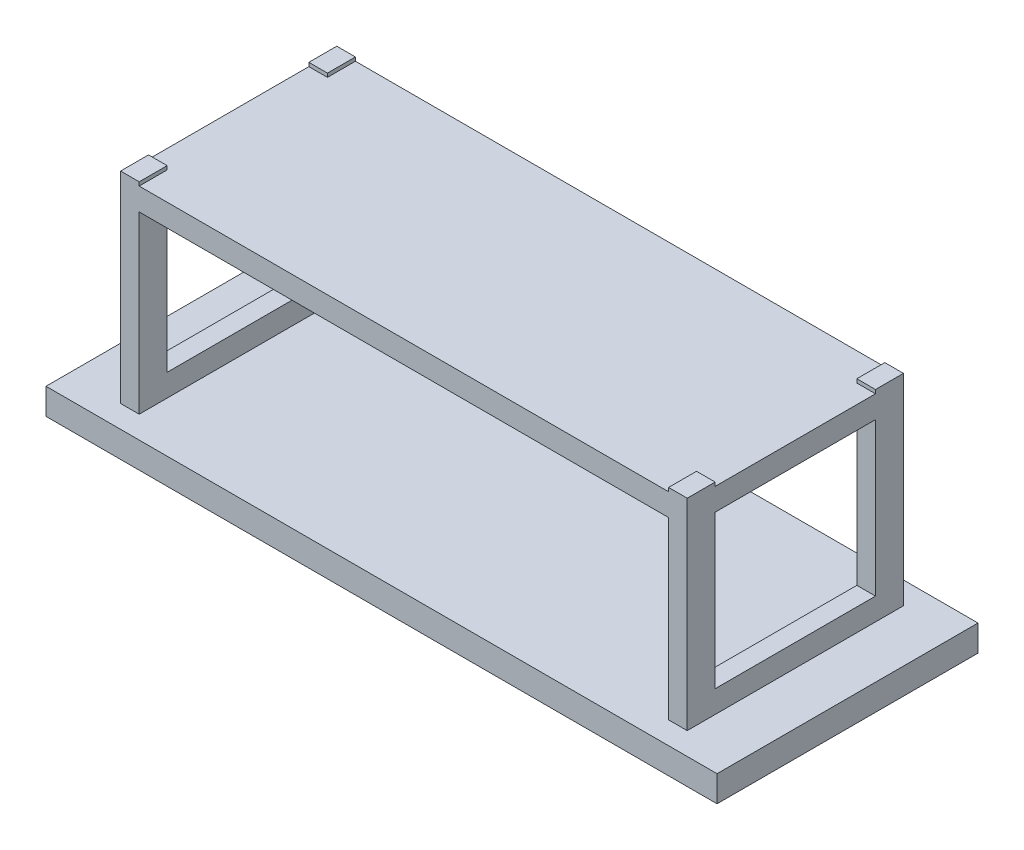
ISO-10303-21;
HEADER;
FILE_DESCRIPTION(('STEP AP214'),'2;1');
FILE_NAME('part.step','',(''),(''),'','','');
FILE_SCHEMA(('AUTOMOTIVE_DESIGN { 1 0 10303 214 1 1 1 1 }'));
ENDSEC;
DATA;
#1=APPLICATION_CONTEXT('core data for automotive mechanical design processes');
#2=APPLICATION_PROTOCOL_DEFINITION('international standard','automotive_design',2000,#1);
#3=PRODUCT_CONTEXT('',#1,'mechanical');
#4=PRODUCT('Part','Part','',(#3));
#5=PRODUCT_RELATED_PRODUCT_CATEGORY('part','',(#4));
#6=PRODUCT_DEFINITION_FORMATION('','',#4);
#7=PRODUCT_DEFINITION_CONTEXT('part definition',#1,'design');
#8=PRODUCT_DEFINITION('design','',#6,#7);
#9=PRODUCT_DEFINITION_SHAPE('','',#8);
#10=(LENGTH_UNIT() NAMED_UNIT(*) SI_UNIT(.MILLI.,.METRE.));
#11=(NAMED_UNIT(*) PLANE_ANGLE_UNIT() SI_UNIT($,.RADIAN.));
#12=(NAMED_UNIT(*) SI_UNIT($,.STERADIAN.) SOLID_ANGLE_UNIT());
#13=UNCERTAINTY_MEASURE_WITH_UNIT(LENGTH_MEASURE(1.E-05),#10,'distance_accuracy_value','');
#14=(GEOMETRIC_REPRESENTATION_CONTEXT(3) GLOBAL_UNCERTAINTY_ASSIGNED_CONTEXT((#13)) GLOBAL_UNIT_ASSIGNED_CONTEXT((#10,
#11,#12)) REPRESENTATION_CONTEXT('',''));
#15=CARTESIAN_POINT('',(0.,0.,0.));
#16=DIRECTION('',(0.,0.,1.));
#17=DIRECTION('',(1.,0.,0.));
#18=AXIS2_PLACEMENT_3D('',#15,#16,#17);
#19=CARTESIAN_POINT('',(190.,130.,-640.));
#20=DIRECTION('',(-1.,0.,0.));
#21=DIRECTION('',(0.,0.,1.));
#22=AXIS2_PLACEMENT_3D('',#19,#20,#21);
#23=PLANE('',#22);
#24=DIRECTION('',(0.,0.,-1.));
#25=VECTOR('',#24,1.);
#26=CARTESIAN_POINT('',(189.999999999998,600.,-59.9999999998558));
#27=LINE('',#26,#25);
#28=CARTESIAN_POINT('',(190.,600.,-565.));
#29=VERTEX_POINT('',#28);
#30=CARTESIAN_POINT('',(189.999999999998,600.,-639.999999999999));
#31=VERTEX_POINT('',#30);
#32=EDGE_CURVE('E249',#29,#31,#27,.T.);
#33=ORIENTED_EDGE('',*,*,#32,.T.);
#34=DIRECTION('',(0.,-1.,0.));
#35=VECTOR('',#34,1.);
#36=CARTESIAN_POINT('',(190.,130.,-640.));
#37=LINE('',#36,#35);
#38=CARTESIAN_POINT('',(190.,610.,-640.));
#39=VERTEX_POINT('',#38);
#40=EDGE_CURVE('E260',#39,#31,#37,.T.);
#41=ORIENTED_EDGE('',*,*,#40,.F.);
#42=DIRECTION('',(0.,0.,-1.));
#43=VECTOR('',#42,1.);
#44=CARTESIAN_POINT('',(190.,610.,-640.));
#45=LINE('',#44,#43);
#46=CARTESIAN_POINT('',(190.,610.,-565.));
#47=VERTEX_POINT('',#46);
#48=EDGE_CURVE('E497',#47,#39,#45,.T.);
#49=ORIENTED_EDGE('',*,*,#48,.F.);
#50=DIRECTION('',(0.,-1.,0.));
#51=VECTOR('',#50,1.);
#52=CARTESIAN_POINT('',(190.,610.,-565.));
#53=LINE('',#52,#51);
#54=EDGE_CURVE('E263',#47,#29,#53,.T.);
#55=ORIENTED_EDGE('',*,*,#54,.T.);
#56=EDGE_LOOP('',(#33,#41,#49,#55));
#57=FACE_BOUND('',#56,.T.);
#58=ADVANCED_FACE('F33',(#57),#23,.F.);
#59=CARTESIAN_POINT('',(189.999999999998,600.,-59.9999999999995));
#60=VERTEX_POINT('',#59);
#61=CARTESIAN_POINT('',(189.999999999998,600.,-134.999999999991));
#62=VERTEX_POINT('',#61);
#63=EDGE_CURVE('E264',#60,#62,#27,.T.);
#64=ORIENTED_EDGE('',*,*,#63,.T.);
#65=DIRECTION('',(0.,-1.,0.));
#66=VECTOR('',#65,1.);
#67=CARTESIAN_POINT('',(190.,610.,-135.));
#68=LINE('',#67,#66);
#69=CARTESIAN_POINT('',(190.,610.,-135.));
#70=VERTEX_POINT('',#69);
#71=EDGE_CURVE('E489',#70,#62,#68,.T.);
#72=ORIENTED_EDGE('',*,*,#71,.F.);
#73=DIRECTION('',(0.,0.,-1.));
#74=VECTOR('',#73,1.);
#75=CARTESIAN_POINT('',(190.,610.,-60.));
#76=LINE('',#75,#74);
#77=CARTESIAN_POINT('',(190.,610.,-60.));
#78=VERTEX_POINT('',#77);
#79=EDGE_CURVE('E477',#78,#70,#76,.T.);
#80=ORIENTED_EDGE('',*,*,#79,.F.);
#81=DIRECTION('',(0.,-1.,0.));
#82=VECTOR('',#81,1.);
#83=CARTESIAN_POINT('',(190.,130.,-60.));
#84=LINE('',#83,#82);
#85=EDGE_CURVE('E274',#78,#60,#84,.T.);
#86=ORIENTED_EDGE('',*,*,#85,.T.);
#87=EDGE_LOOP('',(#64,#72,#80,#86));
#88=FACE_BOUND('',#87,.T.);
#89=ADVANCED_FACE('F571',(#88),#23,.F.);
#90=DIRECTION('',(0.,0.,-1.));
#91=VECTOR('',#90,1.);
#92=CARTESIAN_POINT('',(190.,540.,500000.));
#93=LINE('',#92,#91);
#94=CARTESIAN_POINT('',(189.999999999998,540.,-59.9999999999995));
#95=VERTEX_POINT('',#94);
#96=CARTESIAN_POINT('',(190.,540.,-134.999999999991));
#97=VERTEX_POINT('',#96);
#98=EDGE_CURVE('E406',#95,#97,#93,.T.);
#99=ORIENTED_EDGE('',*,*,#98,.F.);
#100=CARTESIAN_POINT('',(190.,70.,-60.));
#101=VERTEX_POINT('',#100);
#102=EDGE_CURVE('E271',#95,#101,#84,.T.);
#103=ORIENTED_EDGE('',*,*,#102,.T.);
#104=DIRECTION('',(0.,0.,-1.));
#105=VECTOR('',#104,1.);
#106=CARTESIAN_POINT('',(190.,70.,-640.));
#107=LINE('',#106,#105);
#108=CARTESIAN_POINT('',(190.,70.,-640.));
#109=VERTEX_POINT('',#108);
#110=EDGE_CURVE('E539',#101,#109,#107,.T.);
#111=ORIENTED_EDGE('',*,*,#110,.T.);
#112=CARTESIAN_POINT('',(189.999999999998,540.,-639.999999999999));
#113=VERTEX_POINT('',#112);
#114=EDGE_CURVE('E272',#113,#109,#37,.T.);
#115=ORIENTED_EDGE('',*,*,#114,.F.);
#116=CARTESIAN_POINT('',(190.,540.,-564.999999999998));
#117=VERTEX_POINT('',#116);
#118=EDGE_CURVE('E412',#117,#113,#93,.T.);
#119=ORIENTED_EDGE('',*,*,#118,.F.);
#120=CARTESIAN_POINT('',(190.,130.,-565.));
#121=VERTEX_POINT('',#120);
#122=EDGE_CURVE('E499',#117,#121,#53,.T.);
#123=ORIENTED_EDGE('',*,*,#122,.T.);
#124=DIRECTION('',(0.,0.,-1.));
#125=VECTOR('',#124,1.);
#126=CARTESIAN_POINT('',(190.,130.,-640.));
#127=LINE('',#126,#125);
#128=CARTESIAN_POINT('',(190.,130.,-135.));
#129=VERTEX_POINT('',#128);
#130=EDGE_CURVE('E314',#129,#121,#127,.T.);
#131=ORIENTED_EDGE('',*,*,#130,.F.);
#132=EDGE_CURVE('E488',#97,#129,#68,.T.);
#133=ORIENTED_EDGE('',*,*,#132,.F.);
#134=EDGE_LOOP('',(#99,#103,#111,#115,#119,#123,#131,#133));
#135=FACE_BOUND('',#134,.T.);
#136=ADVANCED_FACE('F534',(#135),#23,.F.);
#137=CARTESIAN_POINT('',(1610.,130.,-640.));
#138=DIRECTION('',(1.,0.,0.));
#139=DIRECTION('',(0.,0.,-1.));
#140=AXIS2_PLACEMENT_3D('',#137,#138,#139);
#141=PLANE('',#140);
#142=DIRECTION('',(0.,0.,-1.));
#143=VECTOR('',#142,1.);
#144=CARTESIAN_POINT('',(1610.,600.,-60.));
#145=LINE('',#144,#143);
#146=CARTESIAN_POINT('',(1610.,600.,-60.));
#147=VERTEX_POINT('',#146);
#148=CARTESIAN_POINT('',(1610.,600.,-134.999999999991));
#149=VERTEX_POINT('',#148);
#150=EDGE_CURVE('E400',#147,#149,#145,.T.);
#151=ORIENTED_EDGE('',*,*,#150,.F.);
#152=DIRECTION('',(0.,-1.,0.));
#153=VECTOR('',#152,1.);
#154=CARTESIAN_POINT('',(1610.,130.,-60.));
#155=LINE('',#154,#153);
#156=CARTESIAN_POINT('',(1610.,610.,-60.));
#157=VERTEX_POINT('',#156);
#158=EDGE_CURVE('E362',#157,#147,#155,.T.);
#159=ORIENTED_EDGE('',*,*,#158,.F.);
#160=DIRECTION('',(0.,0.,1.));
#161=VECTOR('',#160,1.);
#162=CARTESIAN_POINT('',(1610.,610.,-60.));
#163=LINE('',#162,#161);
#164=CARTESIAN_POINT('',(1610.,610.,-135.));
#165=VERTEX_POINT('',#164);
#166=EDGE_CURVE('E446',#165,#157,#163,.T.);
#167=ORIENTED_EDGE('',*,*,#166,.F.);
#168=DIRECTION('',(0.,-1.,0.));
#169=VECTOR('',#168,1.);
#170=CARTESIAN_POINT('',(1610.,610.,-135.));
#171=LINE('',#170,#169);
#172=EDGE_CURVE('E454',#165,#149,#171,.T.);
#173=ORIENTED_EDGE('',*,*,#172,.T.);
#174=EDGE_LOOP('',(#151,#159,#167,#173));
#175=FACE_BOUND('',#174,.T.);
#176=ADVANCED_FACE('F580',(#175),#141,.F.);
#177=CARTESIAN_POINT('',(1610.,600.,-564.999999999998));
#178=VERTEX_POINT('',#177);
#179=CARTESIAN_POINT('',(1610.,600.,-640.));
#180=VERTEX_POINT('',#179);
#181=EDGE_CURVE('E251',#178,#180,#145,.T.);
#182=ORIENTED_EDGE('',*,*,#181,.F.);
#183=DIRECTION('',(0.,-1.,0.));
#184=VECTOR('',#183,1.);
#185=CARTESIAN_POINT('',(1610.,610.,-565.));
#186=LINE('',#185,#184);
#187=CARTESIAN_POINT('',(1610.,610.,-565.));
#188=VERTEX_POINT('',#187);
#189=EDGE_CURVE('E484',#188,#178,#186,.T.);
#190=ORIENTED_EDGE('',*,*,#189,.F.);
#191=DIRECTION('',(0.,0.,1.));
#192=VECTOR('',#191,1.);
#193=CARTESIAN_POINT('',(1610.,610.,-640.));
#194=LINE('',#193,#192);
#195=CARTESIAN_POINT('',(1610.,610.,-640.));
#196=VERTEX_POINT('',#195);
#197=EDGE_CURVE('E464',#196,#188,#194,.T.);
#198=ORIENTED_EDGE('',*,*,#197,.F.);
#199=DIRECTION('',(0.,-1.,0.));
#200=VECTOR('',#199,1.);
#201=CARTESIAN_POINT('',(1610.,130.,-640.));
#202=LINE('',#201,#200);
#203=EDGE_CURVE('E59',#196,#180,#202,.T.);
#204=ORIENTED_EDGE('',*,*,#203,.T.);
#205=EDGE_LOOP('',(#182,#190,#198,#204));
#206=FACE_BOUND('',#205,.T.);
#207=ADVANCED_FACE('F584',(#206),#141,.F.);
#208=DIRECTION('',(0.,0.,1.));
#209=VECTOR('',#208,1.);
#210=CARTESIAN_POINT('',(1610.,540.,-60.));
#211=LINE('',#210,#209);
#212=CARTESIAN_POINT('',(1610.,540.,-640.));
#213=VERTEX_POINT('',#212);
#214=CARTESIAN_POINT('',(1610.,540.,-565.));
#215=VERTEX_POINT('',#214);
#216=EDGE_CURVE('E51',#213,#215,#211,.T.);
#217=ORIENTED_EDGE('',*,*,#216,.F.);
#218=CARTESIAN_POINT('',(1610.,70.,-640.));
#219=VERTEX_POINT('',#218);
#220=EDGE_CURVE('E364',#213,#219,#202,.T.);
#221=ORIENTED_EDGE('',*,*,#220,.T.);
#222=DIRECTION('',(0.,0.,1.));
#223=VECTOR('',#222,1.);
#224=CARTESIAN_POINT('',(1610.,70.,-640.));
#225=LINE('',#224,#223);
#226=CARTESIAN_POINT('',(1610.,70.,-60.));
#227=VERTEX_POINT('',#226);
#228=EDGE_CURVE('E353',#219,#227,#225,.T.);
#229=ORIENTED_EDGE('',*,*,#228,.T.);
#230=CARTESIAN_POINT('',(1610.,540.,-60.));
#231=VERTEX_POINT('',#230);
#232=EDGE_CURVE('E361',#231,#227,#155,.T.);
#233=ORIENTED_EDGE('',*,*,#232,.F.);
#234=CARTESIAN_POINT('',(1610.,540.,-135.));
#235=VERTEX_POINT('',#234);
#236=EDGE_CURVE('E392',#235,#231,#211,.T.);
#237=ORIENTED_EDGE('',*,*,#236,.F.);
#238=CARTESIAN_POINT('',(1610.,130.,-135.));
#239=VERTEX_POINT('',#238);
#240=EDGE_CURVE('E451',#235,#239,#171,.T.);
#241=ORIENTED_EDGE('',*,*,#240,.T.);
#242=DIRECTION('',(0.,0.,1.));
#243=VECTOR('',#242,1.);
#244=CARTESIAN_POINT('',(1610.,130.,-640.));
#245=LINE('',#244,#243);
#246=CARTESIAN_POINT('',(1610.,130.,-565.));
#247=VERTEX_POINT('',#246);
#248=EDGE_CURVE('E333',#247,#239,#245,.T.);
#249=ORIENTED_EDGE('',*,*,#248,.F.);
#250=EDGE_CURVE('E508',#215,#247,#186,.T.);
#251=ORIENTED_EDGE('',*,*,#250,.F.);
#252=EDGE_LOOP('',(#217,#221,#229,#233,#237,#241,#249,#251));
#253=FACE_BOUND('',#252,.T.);
#254=ADVANCED_FACE('F367',(#253),#141,.F.);
#255=CARTESIAN_POINT('',(140.,610.,-565.));
#256=DIRECTION('',(0.,0.,-1.));
#257=DIRECTION('',(-1.,0.,0.));
#258=AXIS2_PLACEMENT_3D('',#255,#256,#257);
#259=PLANE('',#258);
#260=DIRECTION('',(1.,0.,0.));
#261=VECTOR('',#260,1.);
#262=CARTESIAN_POINT('',(190.,540.,-565.));
#263=LINE('',#262,#261);
#264=CARTESIAN_POINT('',(140.,540.,-565.));
#265=VERTEX_POINT('',#264);
#266=EDGE_CURVE('E413',#265,#117,#263,.T.);
#267=ORIENTED_EDGE('',*,*,#266,.F.);
#268=DIRECTION('',(0.,-1.,0.));
#269=VECTOR('',#268,1.);
#270=CARTESIAN_POINT('',(140.,610.,-565.));
#271=LINE('',#270,#269);
#272=CARTESIAN_POINT('',(140.,130.,-565.));
#273=VERTEX_POINT('',#272);
#274=EDGE_CURVE('E37',#265,#273,#271,.T.);
#275=ORIENTED_EDGE('',*,*,#274,.T.);
#276=DIRECTION('',(1.,0.,0.));
#277=VECTOR('',#276,1.);
#278=CARTESIAN_POINT('',(140.,130.,-565.));
#279=LINE('',#278,#277);
#280=EDGE_CURVE('E316',#273,#121,#279,.T.);
#281=ORIENTED_EDGE('',*,*,#280,.T.);
#282=ORIENTED_EDGE('',*,*,#122,.F.);
#283=EDGE_LOOP('',(#267,#275,#281,#282));
#284=FACE_BOUND('',#283,.T.);
#285=ADVANCED_FACE('F521',(#284),#259,.F.);
#286=DIRECTION('',(-1.,0.,0.));
#287=VECTOR('',#286,1.);
#288=CARTESIAN_POINT('',(190.,600.,-565.));
#289=LINE('',#288,#287);
#290=CARTESIAN_POINT('',(140.,600.,-565.));
#291=VERTEX_POINT('',#290);
#292=EDGE_CURVE('E416',#29,#291,#289,.T.);
#293=ORIENTED_EDGE('',*,*,#292,.F.);
#294=ORIENTED_EDGE('',*,*,#54,.F.);
#295=DIRECTION('',(1.,0.,0.));
#296=VECTOR('',#295,1.);
#297=CARTESIAN_POINT('',(140.,610.,-565.));
#298=LINE('',#297,#296);
#299=CARTESIAN_POINT('',(140.,610.,-565.));
#300=VERTEX_POINT('',#299);
#301=EDGE_CURVE('E495',#300,#47,#298,.T.);
#302=ORIENTED_EDGE('',*,*,#301,.F.);
#303=EDGE_CURVE('E350',#300,#291,#271,.T.);
#304=ORIENTED_EDGE('',*,*,#303,.T.);
#305=EDGE_LOOP('',(#293,#294,#302,#304));
#306=FACE_BOUND('',#305,.T.);
#307=ADVANCED_FACE('F557',(#306),#259,.F.);
#308=CARTESIAN_POINT('',(140.,610.,-135.));
#309=DIRECTION('',(0.,0.,1.));
#310=DIRECTION('',(1.,0.,0.));
#311=AXIS2_PLACEMENT_3D('',#308,#309,#310);
#312=PLANE('',#311);
#313=DIRECTION('',(1.,0.,0.));
#314=VECTOR('',#313,1.);
#315=CARTESIAN_POINT('',(190.,540.,-134.999999999991));
#316=LINE('',#315,#314);
#317=CARTESIAN_POINT('',(140.,540.,-135.));
#318=VERTEX_POINT('',#317);
#319=EDGE_CURVE('E402',#318,#97,#316,.T.);
#320=ORIENTED_EDGE('',*,*,#319,.T.);
#321=ORIENTED_EDGE('',*,*,#132,.T.);
#322=DIRECTION('',(-1.,0.,0.));
#323=VECTOR('',#322,1.);
#324=CARTESIAN_POINT('',(140.,130.,-135.));
#325=LINE('',#324,#323);
#326=CARTESIAN_POINT('',(140.,130.,-135.));
#327=VERTEX_POINT('',#326);
#328=EDGE_CURVE('E474',#129,#327,#325,.T.);
#329=ORIENTED_EDGE('',*,*,#328,.T.);
#330=DIRECTION('',(0.,-1.,0.));
#331=VECTOR('',#330,1.);
#332=CARTESIAN_POINT('',(140.,610.,-135.));
#333=LINE('',#332,#331);
#334=EDGE_CURVE('E481',#318,#327,#333,.T.);
#335=ORIENTED_EDGE('',*,*,#334,.F.);
#336=EDGE_LOOP('',(#320,#321,#329,#335));
#337=FACE_BOUND('',#336,.T.);
#338=ADVANCED_FACE('F532',(#337),#312,.F.);
#339=DIRECTION('',(-1.,0.,0.));
#340=VECTOR('',#339,1.);
#341=CARTESIAN_POINT('',(190.,600.,-134.999999999991));
#342=LINE('',#341,#340);
#343=CARTESIAN_POINT('',(140.,600.,-135.));
#344=VERTEX_POINT('',#343);
#345=EDGE_CURVE('E421',#62,#344,#342,.T.);
#346=ORIENTED_EDGE('',*,*,#345,.T.);
#347=CARTESIAN_POINT('',(140.,610.,-135.));
#348=VERTEX_POINT('',#347);
#349=EDGE_CURVE('E485',#348,#344,#333,.T.);
#350=ORIENTED_EDGE('',*,*,#349,.F.);
#351=DIRECTION('',(-1.,0.,0.));
#352=VECTOR('',#351,1.);
#353=CARTESIAN_POINT('',(140.,610.,-135.));
#354=LINE('',#353,#352);
#355=EDGE_CURVE('E479',#70,#348,#354,.T.);
#356=ORIENTED_EDGE('',*,*,#355,.F.);
#357=ORIENTED_EDGE('',*,*,#71,.T.);
#358=EDGE_LOOP('',(#346,#350,#356,#357));
#359=FACE_BOUND('',#358,.T.);
#360=ADVANCED_FACE('F639',(#359),#312,.F.);
#361=CARTESIAN_POINT('',(1660.,610.,-565.));
#362=DIRECTION('',(0.,0.,-1.));
#363=DIRECTION('',(-1.,0.,0.));
#364=AXIS2_PLACEMENT_3D('',#361,#362,#363);
#365=PLANE('',#364);
#366=DIRECTION('',(1.,0.,0.));
#367=VECTOR('',#366,1.);
#368=CARTESIAN_POINT('',(1660.,540.,-565.));
#369=LINE('',#368,#367);
#370=CARTESIAN_POINT('',(1660.,540.,-565.));
#371=VERTEX_POINT('',#370);
#372=EDGE_CURVE('E426',#215,#371,#369,.T.);
#373=ORIENTED_EDGE('',*,*,#372,.F.);
#374=ORIENTED_EDGE('',*,*,#250,.T.);
#375=DIRECTION('',(1.,0.,0.));
#376=VECTOR('',#375,1.);
#377=CARTESIAN_POINT('',(1660.,130.,-565.));
#378=LINE('',#377,#376);
#379=CARTESIAN_POINT('',(1660.,130.,-565.));
#380=VERTEX_POINT('',#379);
#381=EDGE_CURVE('E339',#247,#380,#378,.T.);
#382=ORIENTED_EDGE('',*,*,#381,.T.);
#383=DIRECTION('',(0.,-1.,0.));
#384=VECTOR('',#383,1.);
#385=CARTESIAN_POINT('',(1660.,610.,-565.));
#386=LINE('',#385,#384);
#387=EDGE_CURVE('E467',#371,#380,#386,.T.);
#388=ORIENTED_EDGE('',*,*,#387,.F.);
#389=EDGE_LOOP('',(#373,#374,#382,#388));
#390=FACE_BOUND('',#389,.T.);
#391=ADVANCED_FACE('F641',(#390),#365,.F.);
#392=DIRECTION('',(-1.,0.,0.));
#393=VECTOR('',#392,1.);
#394=CARTESIAN_POINT('',(1660.,600.,-565.));
#395=LINE('',#394,#393);
#396=CARTESIAN_POINT('',(1660.,600.,-565.));
#397=VERTEX_POINT('',#396);
#398=EDGE_CURVE('E430',#397,#178,#395,.T.);
#399=ORIENTED_EDGE('',*,*,#398,.F.);
#400=CARTESIAN_POINT('',(1660.,610.,-565.));
#401=VERTEX_POINT('',#400);
#402=EDGE_CURVE('E622',#401,#397,#386,.T.);
#403=ORIENTED_EDGE('',*,*,#402,.F.);
#404=DIRECTION('',(1.,0.,0.));
#405=VECTOR('',#404,1.);
#406=CARTESIAN_POINT('',(1660.,610.,-565.));
#407=LINE('',#406,#405);
#408=EDGE_CURVE('E466',#188,#401,#407,.T.);
#409=ORIENTED_EDGE('',*,*,#408,.F.);
#410=ORIENTED_EDGE('',*,*,#189,.T.);
#411=EDGE_LOOP('',(#399,#403,#409,#410));
#412=FACE_BOUND('',#411,.T.);
#413=ADVANCED_FACE('F646',(#412),#365,.F.);
#414=CARTESIAN_POINT('',(1660.,610.,-135.));
#415=DIRECTION('',(0.,0.,1.));
#416=DIRECTION('',(1.,0.,0.));
#417=AXIS2_PLACEMENT_3D('',#414,#415,#416);
#418=PLANE('',#417);
#419=DIRECTION('',(1.,0.,0.));
#420=VECTOR('',#419,1.);
#421=CARTESIAN_POINT('',(1660.,540.,-134.999999999991));
#422=LINE('',#421,#420);
#423=CARTESIAN_POINT('',(1660.,540.,-134.999999999991));
#424=VERTEX_POINT('',#423);
#425=EDGE_CURVE('E398',#235,#424,#422,.T.);
#426=ORIENTED_EDGE('',*,*,#425,.T.);
#427=DIRECTION('',(0.,-1.,0.));
#428=VECTOR('',#427,1.);
#429=CARTESIAN_POINT('',(1660.,610.,-135.));
#430=LINE('',#429,#428);
#431=CARTESIAN_POINT('',(1660.,130.,-135.));
#432=VERTEX_POINT('',#431);
#433=EDGE_CURVE('E457',#424,#432,#430,.T.);
#434=ORIENTED_EDGE('',*,*,#433,.T.);
#435=DIRECTION('',(-1.,0.,0.));
#436=VECTOR('',#435,1.);
#437=CARTESIAN_POINT('',(1660.,130.,-135.));
#438=LINE('',#437,#436);
#439=EDGE_CURVE('E429',#432,#239,#438,.T.);
#440=ORIENTED_EDGE('',*,*,#439,.T.);
#441=ORIENTED_EDGE('',*,*,#240,.F.);
#442=EDGE_LOOP('',(#426,#434,#440,#441));
#443=FACE_BOUND('',#442,.T.);
#444=ADVANCED_FACE('F607',(#443),#418,.F.);
#445=DIRECTION('',(-1.,0.,0.));
#446=VECTOR('',#445,1.);
#447=CARTESIAN_POINT('',(1660.,600.,-134.999999999991));
#448=LINE('',#447,#446);
#449=CARTESIAN_POINT('',(1660.,600.,-134.999999999991));
#450=VERTEX_POINT('',#449);
#451=EDGE_CURVE('E436',#450,#149,#448,.T.);
#452=ORIENTED_EDGE('',*,*,#451,.T.);
#453=ORIENTED_EDGE('',*,*,#172,.F.);
#454=DIRECTION('',(-1.,0.,0.));
#455=VECTOR('',#454,1.);
#456=CARTESIAN_POINT('',(1660.,610.,-135.));
#457=LINE('',#456,#455);
#458=CARTESIAN_POINT('',(1660.,610.,-135.));
#459=VERTEX_POINT('',#458);
#460=EDGE_CURVE('E444',#459,#165,#457,.T.);
#461=ORIENTED_EDGE('',*,*,#460,.F.);
#462=EDGE_CURVE('E458',#459,#450,#430,.T.);
#463=ORIENTED_EDGE('',*,*,#462,.T.);
#464=EDGE_LOOP('',(#452,#453,#461,#463));
#465=FACE_BOUND('',#464,.T.);
#466=ADVANCED_FACE('F600',(#465),#418,.F.);
#467=CARTESIAN_POINT('',(0.,130.,0.));
#468=DIRECTION('',(0.,-1.,0.));
#469=DIRECTION('',(0.,0.,-1.));
#470=AXIS2_PLACEMENT_3D('',#467,#468,#469);
#471=PLANE('',#470);
#472=ORIENTED_EDGE('',*,*,#439,.F.);
#473=DIRECTION('',(0.,0.,-1.));
#474=VECTOR('',#473,1.);
#475=CARTESIAN_POINT('',(1660.,130.,-640.));
#476=LINE('',#475,#474);
#477=EDGE_CURVE('E338',#432,#380,#476,.T.);
#478=ORIENTED_EDGE('',*,*,#477,.T.);
#479=ORIENTED_EDGE('',*,*,#381,.F.);
#480=ORIENTED_EDGE('',*,*,#248,.T.);
#481=EDGE_LOOP('',(#472,#478,#479,#480));
#482=FACE_BOUND('',#481,.T.);
#483=ADVANCED_FACE('F598',(#482),#471,.F.);
#484=CARTESIAN_POINT('',(0.,130.,0.));
#485=DIRECTION('',(0.,1.,0.));
#486=DIRECTION('',(0.,0.,1.));
#487=AXIS2_PLACEMENT_3D('',#484,#485,#486);
#488=PLANE('',#487);
#489=DIRECTION('',(0.,0.,1.));
#490=VECTOR('',#489,1.);
#491=CARTESIAN_POINT('',(140.,130.,-640.));
#492=LINE('',#491,#490);
#493=EDGE_CURVE('E310',#273,#327,#492,.T.);
#494=ORIENTED_EDGE('',*,*,#493,.T.);
#495=ORIENTED_EDGE('',*,*,#328,.F.);
#496=ORIENTED_EDGE('',*,*,#130,.T.);
#497=ORIENTED_EDGE('',*,*,#280,.F.);
#498=EDGE_LOOP('',(#494,#495,#496,#497));
#499=FACE_BOUND('',#498,.T.);
#500=ADVANCED_FACE('F526',(#499),#488,.T.);
#501=CARTESIAN_POINT('',(0.,70.,0.));
#502=DIRECTION('',(0.,-1.,0.));
#503=DIRECTION('',(0.,0.,-1.));
#504=AXIS2_PLACEMENT_3D('',#501,#502,#503);
#505=PLANE('',#504);
#506=DIRECTION('',(0.,0.,1.));
#507=VECTOR('',#506,1.);
#508=CARTESIAN_POINT('',(140.,70.,-640.));
#509=LINE('',#508,#507);
#510=CARTESIAN_POINT('',(140.,70.,-640.));
#511=VERTEX_POINT('',#510);
#512=CARTESIAN_POINT('',(140.,70.,-60.));
#513=VERTEX_POINT('',#512);
#514=EDGE_CURVE('E326',#511,#513,#509,.T.);
#515=ORIENTED_EDGE('',*,*,#514,.F.);
#516=DIRECTION('',(-1.,0.,0.));
#517=VECTOR('',#516,1.);
#518=CARTESIAN_POINT('',(140.,70.,-640.));
#519=LINE('',#518,#517);
#520=EDGE_CURVE('E315',#109,#511,#519,.T.);
#521=ORIENTED_EDGE('',*,*,#520,.F.);
#522=ORIENTED_EDGE('',*,*,#110,.F.);
#523=DIRECTION('',(1.,0.,0.));
#524=VECTOR('',#523,1.);
#525=CARTESIAN_POINT('',(140.,70.,-60.));
#526=LINE('',#525,#524);
#527=EDGE_CURVE('E541',#513,#101,#526,.T.);
#528=ORIENTED_EDGE('',*,*,#527,.F.);
#529=EDGE_LOOP('',(#515,#521,#522,#528));
#530=FACE_BOUND('',#529,.T.);
#531=DIRECTION('',(0.,0.,1.));
#532=VECTOR('',#531,1.);
#533=CARTESIAN_POINT('',(0.,70.,0.));
#534=LINE('',#533,#532);
#535=CARTESIAN_POINT('',(0.,70.,-700.));
#536=VERTEX_POINT('',#535);
#537=CARTESIAN_POINT('',(0.,70.,0.));
#538=VERTEX_POINT('',#537);
#539=EDGE_CURVE('E285',#536,#538,#534,.T.);
#540=ORIENTED_EDGE('',*,*,#539,.T.);
#541=DIRECTION('',(1.,0.,0.));
#542=VECTOR('',#541,1.);
#543=CARTESIAN_POINT('',(0.,70.,0.));
#544=LINE('',#543,#542);
#545=CARTESIAN_POINT('',(1800.,70.,0.));
#546=VERTEX_POINT('',#545);
#547=EDGE_CURVE('E288',#538,#546,#544,.T.);
#548=ORIENTED_EDGE('',*,*,#547,.T.);
#549=DIRECTION('',(0.,0.,-1.));
#550=VECTOR('',#549,1.);
#551=CARTESIAN_POINT('',(1800.,70.,0.));
#552=LINE('',#551,#550);
#553=CARTESIAN_POINT('',(1800.,70.,-700.));
#554=VERTEX_POINT('',#553);
#555=EDGE_CURVE('E291',#546,#554,#552,.T.);
#556=ORIENTED_EDGE('',*,*,#555,.T.);
#557=DIRECTION('',(-1.,0.,0.));
#558=VECTOR('',#557,1.);
#559=CARTESIAN_POINT('',(0.,70.,-700.));
#560=LINE('',#559,#558);
#561=EDGE_CURVE('E293',#554,#536,#560,.T.);
#562=ORIENTED_EDGE('',*,*,#561,.T.);
#563=EDGE_LOOP('',(#540,#548,#556,#562));
#564=FACE_BOUND('',#563,.T.);
#565=DIRECTION('',(0.,0.,-1.));
#566=VECTOR('',#565,1.);
#567=CARTESIAN_POINT('',(1660.,70.,-640.));
#568=LINE('',#567,#566);
#569=CARTESIAN_POINT('',(1660.,70.,-60.));
#570=VERTEX_POINT('',#569);
#571=CARTESIAN_POINT('',(1660.,70.,-640.));
#572=VERTEX_POINT('',#571);
#573=EDGE_CURVE('E346',#570,#572,#568,.T.);
#574=ORIENTED_EDGE('',*,*,#573,.F.);
#575=DIRECTION('',(1.,0.,0.));
#576=VECTOR('',#575,1.);
#577=CARTESIAN_POINT('',(1660.,70.,-60.));
#578=LINE('',#577,#576);
#579=EDGE_CURVE('E356',#227,#570,#578,.T.);
#580=ORIENTED_EDGE('',*,*,#579,.F.);
#581=ORIENTED_EDGE('',*,*,#228,.F.);
#582=DIRECTION('',(-1.,0.,0.));
#583=VECTOR('',#582,1.);
#584=CARTESIAN_POINT('',(1660.,70.,-640.));
#585=LINE('',#584,#583);
#586=EDGE_CURVE('E349',#572,#219,#585,.T.);
#587=ORIENTED_EDGE('',*,*,#586,.F.);
#588=EDGE_LOOP('',(#574,#580,#581,#587));
#589=FACE_BOUND('',#588,.T.);
#590=ADVANCED_FACE('F372',(#530,#564,#589),#505,.F.);
#591=CARTESIAN_POINT('',(0.,70.,0.));
#592=DIRECTION('',(1.,0.,0.));
#593=DIRECTION('',(0.,0.,-1.));
#594=AXIS2_PLACEMENT_3D('',#591,#592,#593);
#595=PLANE('',#594);
#596=DIRECTION('',(0.,0.,1.));
#597=VECTOR('',#596,1.);
#598=CARTESIAN_POINT('',(0.,0.,0.));
#599=LINE('',#598,#597);
#600=CARTESIAN_POINT('',(0.,0.,-700.));
#601=VERTEX_POINT('',#600);
#602=CARTESIAN_POINT('',(0.,0.,0.));
#603=VERTEX_POINT('',#602);
#604=EDGE_CURVE('E284',#601,#603,#599,.T.);
#605=ORIENTED_EDGE('',*,*,#604,.T.);
#606=DIRECTION('',(0.,-1.,0.));
#607=VECTOR('',#606,1.);
#608=CARTESIAN_POINT('',(0.,70.,0.));
#609=LINE('',#608,#607);
#610=EDGE_CURVE('E11',#538,#603,#609,.T.);
#611=ORIENTED_EDGE('',*,*,#610,.F.);
#612=ORIENTED_EDGE('',*,*,#539,.F.);
#613=DIRECTION('',(0.,-1.,0.));
#614=VECTOR('',#613,1.);
#615=CARTESIAN_POINT('',(0.,70.,-700.));
#616=LINE('',#615,#614);
#617=EDGE_CURVE('E295',#536,#601,#616,.T.);
#618=ORIENTED_EDGE('',*,*,#617,.T.);
#619=EDGE_LOOP('',(#605,#611,#612,#618));
#620=FACE_BOUND('',#619,.T.);
#621=ADVANCED_FACE('F35',(#620),#595,.F.);
#622=CARTESIAN_POINT('',(0.,70.,0.));
#623=DIRECTION('',(0.,0.,-1.));
#624=DIRECTION('',(-1.,0.,0.));
#625=AXIS2_PLACEMENT_3D('',#622,#623,#624);
#626=PLANE('',#625);
#627=DIRECTION('',(1.,0.,0.));
#628=VECTOR('',#627,1.);
#629=CARTESIAN_POINT('',(0.,0.,0.));
#630=LINE('',#629,#628);
#631=CARTESIAN_POINT('',(1800.,0.,0.));
#632=VERTEX_POINT('',#631);
#633=EDGE_CURVE('E298',#603,#632,#630,.T.);
#634=ORIENTED_EDGE('',*,*,#633,.T.);
#635=DIRECTION('',(0.,-1.,0.));
#636=VECTOR('',#635,1.);
#637=CARTESIAN_POINT('',(1800.,70.,0.));
#638=LINE('',#637,#636);
#639=EDGE_CURVE('E43',#546,#632,#638,.T.);
#640=ORIENTED_EDGE('',*,*,#639,.F.);
#641=ORIENTED_EDGE('',*,*,#547,.F.);
#642=ORIENTED_EDGE('',*,*,#610,.T.);
#643=EDGE_LOOP('',(#634,#640,#641,#642));
#644=FACE_BOUND('',#643,.T.);
#645=ADVANCED_FACE('F869',(#644),#626,.F.);
#646=CARTESIAN_POINT('',(1800.,70.,0.));
#647=DIRECTION('',(-1.,0.,0.));
#648=DIRECTION('',(0.,0.,1.));
#649=AXIS2_PLACEMENT_3D('',#646,#647,#648);
#650=PLANE('',#649);
#651=DIRECTION('',(0.,0.,-1.));
#652=VECTOR('',#651,1.);
#653=CARTESIAN_POINT('',(1800.,0.,0.));
#654=LINE('',#653,#652);
#655=CARTESIAN_POINT('',(1800.,0.,-700.));
#656=VERTEX_POINT('',#655);
#657=EDGE_CURVE('E300',#632,#656,#654,.T.);
#658=ORIENTED_EDGE('',*,*,#657,.T.);
#659=DIRECTION('',(0.,-1.,0.));
#660=VECTOR('',#659,1.);
#661=CARTESIAN_POINT('',(1800.,70.,-700.));
#662=LINE('',#661,#660);
#663=EDGE_CURVE('E305',#554,#656,#662,.T.);
#664=ORIENTED_EDGE('',*,*,#663,.F.);
#665=ORIENTED_EDGE('',*,*,#555,.F.);
#666=ORIENTED_EDGE('',*,*,#639,.T.);
#667=EDGE_LOOP('',(#658,#664,#665,#666));
#668=FACE_BOUND('',#667,.T.);
#669=ADVANCED_FACE('F859',(#668),#650,.F.);
#670=CARTESIAN_POINT('',(0.,70.,-700.));
#671=DIRECTION('',(0.,0.,1.));
#672=DIRECTION('',(1.,0.,0.));
#673=AXIS2_PLACEMENT_3D('',#670,#671,#672);
#674=PLANE('',#673);
#675=DIRECTION('',(-1.,0.,0.));
#676=VECTOR('',#675,1.);
#677=CARTESIAN_POINT('',(0.,0.,-700.));
#678=LINE('',#677,#676);
#679=EDGE_CURVE('E289',#656,#601,#678,.T.);
#680=ORIENTED_EDGE('',*,*,#679,.T.);
#681=ORIENTED_EDGE('',*,*,#617,.F.);
#682=ORIENTED_EDGE('',*,*,#561,.F.);
#683=ORIENTED_EDGE('',*,*,#663,.T.);
#684=EDGE_LOOP('',(#680,#681,#682,#683));
#685=FACE_BOUND('',#684,.T.);
#686=ADVANCED_FACE('F849',(#685),#674,.F.);
#687=CARTESIAN_POINT('',(0.,0.,0.));
#688=DIRECTION('',(0.,-1.,0.));
#689=DIRECTION('',(0.,0.,-1.));
#690=AXIS2_PLACEMENT_3D('',#687,#688,#689);
#691=PLANE('',#690);
#692=ORIENTED_EDGE('',*,*,#604,.F.);
#693=ORIENTED_EDGE('',*,*,#679,.F.);
#694=ORIENTED_EDGE('',*,*,#657,.F.);
#695=ORIENTED_EDGE('',*,*,#633,.F.);
#696=EDGE_LOOP('',(#692,#693,#694,#695));
#697=FACE_BOUND('',#696,.T.);
#698=ADVANCED_FACE('F793',(#697),#691,.T.);
#699=CARTESIAN_POINT('',(140.,130.,-640.));
#700=DIRECTION('',(1.,0.,0.));
#701=DIRECTION('',(0.,0.,-1.));
#702=AXIS2_PLACEMENT_3D('',#699,#700,#701);
#703=PLANE('',#702);
#704=ORIENTED_EDGE('',*,*,#274,.F.);
#705=DIRECTION('',(0.,0.,-1.));
#706=VECTOR('',#705,1.);
#707=CARTESIAN_POINT('',(140.,540.,500000.));
#708=LINE('',#707,#706);
#709=EDGE_CURVE('E418',#318,#265,#708,.T.);
#710=ORIENTED_EDGE('',*,*,#709,.F.);
#711=ORIENTED_EDGE('',*,*,#334,.T.);
#712=ORIENTED_EDGE('',*,*,#493,.F.);
#713=EDGE_LOOP('',(#704,#710,#711,#712));
#714=FACE_BOUND('',#713,.T.);
#715=ORIENTED_EDGE('',*,*,#514,.T.);
#716=DIRECTION('',(0.,-1.,0.));
#717=VECTOR('',#716,1.);
#718=CARTESIAN_POINT('',(140.,130.,-60.));
#719=LINE('',#718,#717);
#720=CARTESIAN_POINT('',(140.,610.,-60.));
#721=VERTEX_POINT('',#720);
#722=EDGE_CURVE('E281',#721,#513,#719,.T.);
#723=ORIENTED_EDGE('',*,*,#722,.F.);
#724=DIRECTION('',(0.,0.,1.));
#725=VECTOR('',#724,1.);
#726=CARTESIAN_POINT('',(140.,610.,-60.));
#727=LINE('',#726,#725);
#728=EDGE_CURVE('E470',#348,#721,#727,.T.);
#729=ORIENTED_EDGE('',*,*,#728,.F.);
#730=ORIENTED_EDGE('',*,*,#349,.T.);
#731=DIRECTION('',(0.,0.,-1.));
#732=VECTOR('',#731,1.);
#733=CARTESIAN_POINT('',(140.,600.,500000.));
#734=LINE('',#733,#732);
#735=EDGE_CURVE('E419',#344,#291,#734,.T.);
#736=ORIENTED_EDGE('',*,*,#735,.T.);
#737=ORIENTED_EDGE('',*,*,#303,.F.);
#738=DIRECTION('',(0.,0.,1.));
#739=VECTOR('',#738,1.);
#740=CARTESIAN_POINT('',(140.,610.,-640.));
#741=LINE('',#740,#739);
#742=CARTESIAN_POINT('',(140.,610.,-640.));
#743=VERTEX_POINT('',#742);
#744=EDGE_CURVE('E492',#743,#300,#741,.T.);
#745=ORIENTED_EDGE('',*,*,#744,.F.);
#746=DIRECTION('',(0.,-1.,0.));
#747=VECTOR('',#746,1.);
#748=CARTESIAN_POINT('',(140.,130.,-640.));
#749=LINE('',#748,#747);
#750=EDGE_CURVE('E276',#743,#511,#749,.T.);
#751=ORIENTED_EDGE('',*,*,#750,.T.);
#752=EDGE_LOOP('',(#715,#723,#729,#730,#736,#737,#745,#751));
#753=FACE_BOUND('',#752,.T.);
#754=ADVANCED_FACE('F528',(#714,#753),#703,.F.);
#755=CARTESIAN_POINT('',(140.,130.,-60.));
#756=DIRECTION('',(0.,0.,-1.));
#757=DIRECTION('',(-1.,0.,0.));
#758=AXIS2_PLACEMENT_3D('',#755,#756,#757);
#759=PLANE('',#758);
#760=ORIENTED_EDGE('',*,*,#527,.T.);
#761=ORIENTED_EDGE('',*,*,#102,.F.);
#762=DIRECTION('',(1.,0.,0.));
#763=VECTOR('',#762,1.);
#764=CARTESIAN_POINT('',(-500000.,540.,-59.999999999808));
#765=LINE('',#764,#763);
#766=EDGE_CURVE('E390',#95,#231,#765,.T.);
#767=ORIENTED_EDGE('',*,*,#766,.T.);
#768=ORIENTED_EDGE('',*,*,#232,.T.);
#769=ORIENTED_EDGE('',*,*,#579,.T.);
#770=DIRECTION('',(0.,-1.,0.));
#771=VECTOR('',#770,1.);
#772=CARTESIAN_POINT('',(1660.,130.,-60.));
#773=LINE('',#772,#771);
#774=CARTESIAN_POINT('',(1660.,610.,-60.));
#775=VERTEX_POINT('',#774);
#776=EDGE_CURVE('E337',#775,#570,#773,.T.);
#777=ORIENTED_EDGE('',*,*,#776,.F.);
#778=DIRECTION('',(1.,0.,0.));
#779=VECTOR('',#778,1.);
#780=CARTESIAN_POINT('',(1660.,610.,-60.));
#781=LINE('',#780,#779);
#782=EDGE_CURVE('E449',#157,#775,#781,.T.);
#783=ORIENTED_EDGE('',*,*,#782,.F.);
#784=ORIENTED_EDGE('',*,*,#158,.T.);
#785=DIRECTION('',(1.,0.,0.));
#786=VECTOR('',#785,1.);
#787=CARTESIAN_POINT('',(-500000.,600.,-59.999999999808));
#788=LINE('',#787,#786);
#789=EDGE_CURVE('E255',#60,#147,#788,.T.);
#790=ORIENTED_EDGE('',*,*,#789,.F.);
#791=ORIENTED_EDGE('',*,*,#85,.F.);
#792=DIRECTION('',(1.,0.,0.));
#793=VECTOR('',#792,1.);
#794=CARTESIAN_POINT('',(140.,610.,-60.));
#795=LINE('',#794,#793);
#796=EDGE_CURVE('E473',#721,#78,#795,.T.);
#797=ORIENTED_EDGE('',*,*,#796,.F.);
#798=ORIENTED_EDGE('',*,*,#722,.T.);
#799=EDGE_LOOP('',(#760,#761,#767,#768,#769,#777,#783,#784,#790,#791,#797,#798));
#800=FACE_BOUND('',#799,.T.);
#801=ADVANCED_FACE('F385',(#800),#759,.F.);
#802=CARTESIAN_POINT('',(140.,130.,-640.));
#803=DIRECTION('',(0.,0.,1.));
#804=DIRECTION('',(1.,0.,0.));
#805=AXIS2_PLACEMENT_3D('',#802,#803,#804);
#806=PLANE('',#805);
#807=ORIENTED_EDGE('',*,*,#520,.T.);
#808=ORIENTED_EDGE('',*,*,#750,.F.);
#809=DIRECTION('',(-1.,0.,0.));
#810=VECTOR('',#809,1.);
#811=CARTESIAN_POINT('',(140.,610.,-640.));
#812=LINE('',#811,#810);
#813=EDGE_CURVE('E270',#39,#743,#812,.T.);
#814=ORIENTED_EDGE('',*,*,#813,.F.);
#815=ORIENTED_EDGE('',*,*,#40,.T.);
#816=DIRECTION('',(1.,0.,0.));
#817=VECTOR('',#816,1.);
#818=CARTESIAN_POINT('',(-500000.,600.,-639.999999999808));
#819=LINE('',#818,#817);
#820=EDGE_CURVE('E245',#31,#180,#819,.T.);
#821=ORIENTED_EDGE('',*,*,#820,.T.);
#822=ORIENTED_EDGE('',*,*,#203,.F.);
#823=DIRECTION('',(-1.,0.,0.));
#824=VECTOR('',#823,1.);
#825=CARTESIAN_POINT('',(1660.,610.,-640.));
#826=LINE('',#825,#824);
#827=CARTESIAN_POINT('',(1660.,610.,-640.));
#828=VERTEX_POINT('',#827);
#829=EDGE_CURVE('E375',#828,#196,#826,.T.);
#830=ORIENTED_EDGE('',*,*,#829,.F.);
#831=DIRECTION('',(0.,-1.,0.));
#832=VECTOR('',#831,1.);
#833=CARTESIAN_POINT('',(1660.,130.,-640.));
#834=LINE('',#833,#832);
#835=EDGE_CURVE('E322',#828,#572,#834,.T.);
#836=ORIENTED_EDGE('',*,*,#835,.T.);
#837=ORIENTED_EDGE('',*,*,#586,.T.);
#838=ORIENTED_EDGE('',*,*,#220,.F.);
#839=DIRECTION('',(1.,0.,0.));
#840=VECTOR('',#839,1.);
#841=CARTESIAN_POINT('',(-500000.,540.,-639.999999999808));
#842=LINE('',#841,#840);
#843=EDGE_CURVE('E254',#113,#213,#842,.T.);
#844=ORIENTED_EDGE('',*,*,#843,.F.);
#845=ORIENTED_EDGE('',*,*,#114,.T.);
#846=EDGE_LOOP('',(#807,#808,#814,#815,#821,#822,#830,#836,#837,#838,#844,#845));
#847=FACE_BOUND('',#846,.T.);
#848=ADVANCED_FACE('F268',(#847),#806,.F.);
#849=CARTESIAN_POINT('',(1660.,130.,-640.));
#850=DIRECTION('',(-1.,0.,0.));
#851=DIRECTION('',(0.,0.,1.));
#852=AXIS2_PLACEMENT_3D('',#849,#850,#851);
#853=PLANE('',#852);
#854=ORIENTED_EDGE('',*,*,#402,.T.);
#855=DIRECTION('',(0.,0.,-1.));
#856=VECTOR('',#855,1.);
#857=CARTESIAN_POINT('',(1660.,600.,500000.));
#858=LINE('',#857,#856);
#859=EDGE_CURVE('E433',#450,#397,#858,.T.);
#860=ORIENTED_EDGE('',*,*,#859,.F.);
#861=ORIENTED_EDGE('',*,*,#462,.F.);
#862=DIRECTION('',(0.,0.,-1.));
#863=VECTOR('',#862,1.);
#864=CARTESIAN_POINT('',(1660.,610.,-60.));
#865=LINE('',#864,#863);
#866=EDGE_CURVE('E441',#775,#459,#865,.T.);
#867=ORIENTED_EDGE('',*,*,#866,.F.);
#868=ORIENTED_EDGE('',*,*,#776,.T.);
#869=ORIENTED_EDGE('',*,*,#573,.T.);
#870=ORIENTED_EDGE('',*,*,#835,.F.);
#871=DIRECTION('',(0.,0.,-1.));
#872=VECTOR('',#871,1.);
#873=CARTESIAN_POINT('',(1660.,610.,-640.));
#874=LINE('',#873,#872);
#875=EDGE_CURVE('E461',#401,#828,#874,.T.);
#876=ORIENTED_EDGE('',*,*,#875,.F.);
#877=EDGE_LOOP('',(#854,#860,#861,#867,#868,#869,#870,#876));
#878=FACE_BOUND('',#877,.T.);
#879=DIRECTION('',(0.,0.,-1.));
#880=VECTOR('',#879,1.);
#881=CARTESIAN_POINT('',(1660.,540.,500000.));
#882=LINE('',#881,#880);
#883=EDGE_CURVE('E432',#424,#371,#882,.T.);
#884=ORIENTED_EDGE('',*,*,#883,.T.);
#885=ORIENTED_EDGE('',*,*,#387,.T.);
#886=ORIENTED_EDGE('',*,*,#477,.F.);
#887=ORIENTED_EDGE('',*,*,#433,.F.);
#888=EDGE_LOOP('',(#884,#885,#886,#887));
#889=FACE_BOUND('',#888,.T.);
#890=ADVANCED_FACE('F380',(#878,#889),#853,.F.);
#891=CARTESIAN_POINT('',(0.,610.,0.));
#892=DIRECTION('',(0.,1.,0.));
#893=DIRECTION('',(0.,0.,1.));
#894=AXIS2_PLACEMENT_3D('',#891,#892,#893);
#895=PLANE('',#894);
#896=ORIENTED_EDGE('',*,*,#744,.T.);
#897=ORIENTED_EDGE('',*,*,#301,.T.);
#898=ORIENTED_EDGE('',*,*,#48,.T.);
#899=ORIENTED_EDGE('',*,*,#813,.T.);
#900=EDGE_LOOP('',(#896,#897,#898,#899));
#901=FACE_BOUND('',#900,.T.);
#902=ADVANCED_FACE('F558',(#901),#895,.T.);
#903=CARTESIAN_POINT('',(0.,610.,0.));
#904=DIRECTION('',(0.,-1.,0.));
#905=DIRECTION('',(0.,0.,-1.));
#906=AXIS2_PLACEMENT_3D('',#903,#904,#905);
#907=PLANE('',#906);
#908=ORIENTED_EDGE('',*,*,#728,.T.);
#909=ORIENTED_EDGE('',*,*,#796,.T.);
#910=ORIENTED_EDGE('',*,*,#79,.T.);
#911=ORIENTED_EDGE('',*,*,#355,.T.);
#912=EDGE_LOOP('',(#908,#909,#910,#911));
#913=FACE_BOUND('',#912,.T.);
#914=ADVANCED_FACE('F551',(#913),#907,.F.);
#915=CARTESIAN_POINT('',(0.,610.,0.));
#916=DIRECTION('',(0.,-1.,0.));
#917=DIRECTION('',(0.,0.,-1.));
#918=AXIS2_PLACEMENT_3D('',#915,#916,#917);
#919=PLANE('',#918);
#920=ORIENTED_EDGE('',*,*,#875,.T.);
#921=ORIENTED_EDGE('',*,*,#829,.T.);
#922=ORIENTED_EDGE('',*,*,#197,.T.);
#923=ORIENTED_EDGE('',*,*,#408,.T.);
#924=EDGE_LOOP('',(#920,#921,#922,#923));
#925=FACE_BOUND('',#924,.T.);
#926=ADVANCED_FACE('F565',(#925),#919,.F.);
#927=CARTESIAN_POINT('',(0.,610.,0.));
#928=DIRECTION('',(0.,1.,0.));
#929=DIRECTION('',(0.,0.,1.));
#930=AXIS2_PLACEMENT_3D('',#927,#928,#929);
#931=PLANE('',#930);
#932=ORIENTED_EDGE('',*,*,#866,.T.);
#933=ORIENTED_EDGE('',*,*,#460,.T.);
#934=ORIENTED_EDGE('',*,*,#166,.T.);
#935=ORIENTED_EDGE('',*,*,#782,.T.);
#936=EDGE_LOOP('',(#932,#933,#934,#935));
#937=FACE_BOUND('',#936,.T.);
#938=ADVANCED_FACE('F637',(#937),#931,.T.);
#939=CARTESIAN_POINT('',(1660.,540.,500000.));
#940=DIRECTION('',(0.,1.,0.));
#941=DIRECTION('',(0.,0.,1.));
#942=AXIS2_PLACEMENT_3D('',#939,#940,#941);
#943=PLANE('',#942);
#944=ORIENTED_EDGE('',*,*,#425,.F.);
#945=ORIENTED_EDGE('',*,*,#236,.T.);
#946=ORIENTED_EDGE('',*,*,#766,.F.);
#947=ORIENTED_EDGE('',*,*,#98,.T.);
#948=ORIENTED_EDGE('',*,*,#319,.F.);
#949=ORIENTED_EDGE('',*,*,#709,.T.);
#950=ORIENTED_EDGE('',*,*,#266,.T.);
#951=ORIENTED_EDGE('',*,*,#118,.T.);
#952=ORIENTED_EDGE('',*,*,#843,.T.);
#953=ORIENTED_EDGE('',*,*,#216,.T.);
#954=ORIENTED_EDGE('',*,*,#372,.T.);
#955=ORIENTED_EDGE('',*,*,#883,.F.);
#956=EDGE_LOOP('',(#944,#945,#946,#947,#948,#949,#950,#951,#952,#953,#954,#955));
#957=FACE_BOUND('',#956,.T.);
#958=ADVANCED_FACE('F395',(#957),#943,.F.);
#959=CARTESIAN_POINT('',(1660.,600.,500000.));
#960=DIRECTION('',(0.,-1.,0.));
#961=DIRECTION('',(0.,0.,-1.));
#962=AXIS2_PLACEMENT_3D('',#959,#960,#961);
#963=PLANE('',#962);
#964=ORIENTED_EDGE('',*,*,#451,.F.);
#965=ORIENTED_EDGE('',*,*,#859,.T.);
#966=ORIENTED_EDGE('',*,*,#398,.T.);
#967=ORIENTED_EDGE('',*,*,#181,.T.);
#968=ORIENTED_EDGE('',*,*,#820,.F.);
#969=ORIENTED_EDGE('',*,*,#32,.F.);
#970=ORIENTED_EDGE('',*,*,#292,.T.);
#971=ORIENTED_EDGE('',*,*,#735,.F.);
#972=ORIENTED_EDGE('',*,*,#345,.F.);
#973=ORIENTED_EDGE('',*,*,#63,.F.);
#974=ORIENTED_EDGE('',*,*,#789,.T.);
#975=ORIENTED_EDGE('',*,*,#150,.T.);
#976=EDGE_LOOP('',(#964,#965,#966,#967,#968,#969,#970,#971,#972,#973,#974,#975));
#977=FACE_BOUND('',#976,.T.);
#978=ADVANCED_FACE('F247',(#977),#963,.F.);
#979=CLOSED_SHELL('',(#58,#89,#136,#176,#207,#254,#285,#307,#338,#360,#391,#413,#444,#466,#483,
#500,#590,#621,#645,#669,#686,#698,#754,#801,#848,#890,#902,#914,#926,#938,#958,#978));
#980=MANIFOLD_SOLID_BREP('B2',#979);
#981=ADVANCED_BREP_SHAPE_REPRESENTATION('',(#18,#980),#14);
#982=SHAPE_DEFINITION_REPRESENTATION(#9,#981);
ENDSEC;
END-ISO-10303-21;
